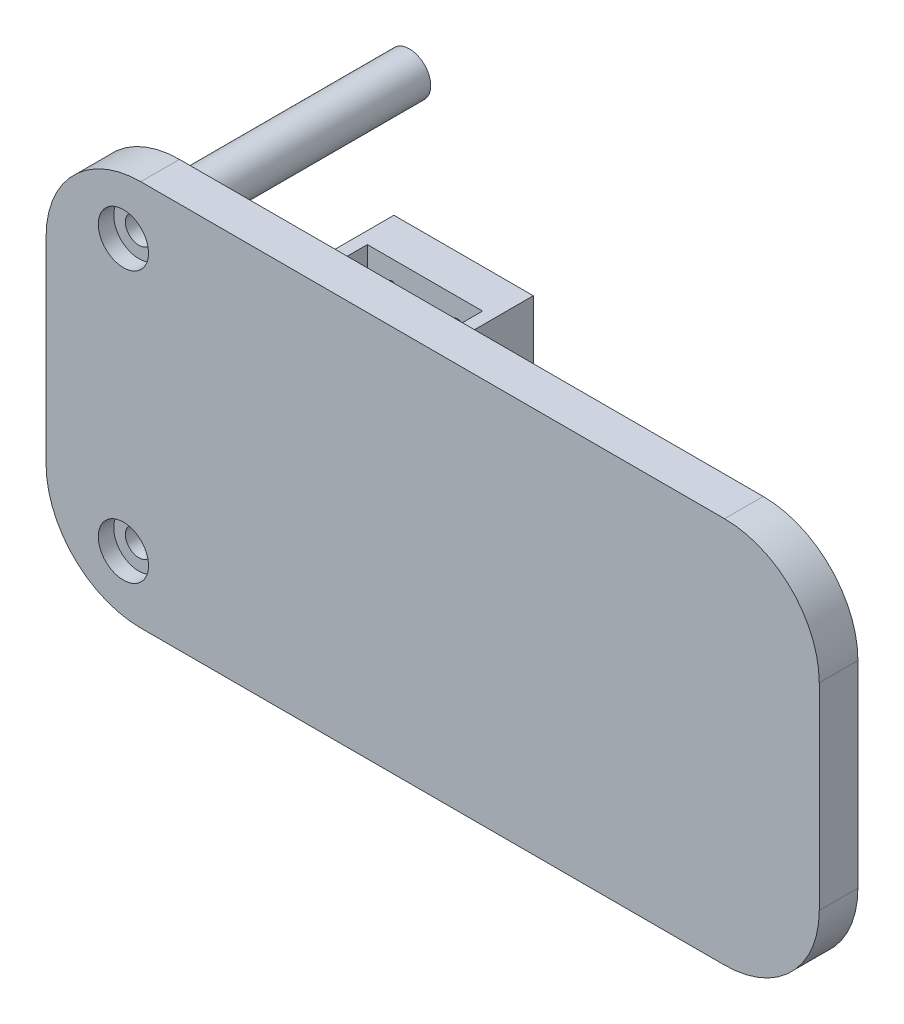
ISO-10303-21;
HEADER;
FILE_DESCRIPTION(('STEP AP214'),'2;1');
FILE_NAME('part.step','',(''),(''),'','','');
FILE_SCHEMA(('AUTOMOTIVE_DESIGN { 1 0 10303 214 1 1 1 1 }'));
ENDSEC;
DATA;
#1=APPLICATION_CONTEXT('core data for automotive mechanical design processes');
#2=APPLICATION_PROTOCOL_DEFINITION('international standard','automotive_design',2000,#1);
#3=PRODUCT_CONTEXT('',#1,'mechanical');
#4=PRODUCT('Part','Part','',(#3));
#5=PRODUCT_RELATED_PRODUCT_CATEGORY('part','',(#4));
#6=PRODUCT_DEFINITION_FORMATION('','',#4);
#7=PRODUCT_DEFINITION_CONTEXT('part definition',#1,'design');
#8=PRODUCT_DEFINITION('design','',#6,#7);
#9=PRODUCT_DEFINITION_SHAPE('','',#8);
#10=(LENGTH_UNIT() NAMED_UNIT(*) SI_UNIT(.MILLI.,.METRE.));
#11=(NAMED_UNIT(*) PLANE_ANGLE_UNIT() SI_UNIT($,.RADIAN.));
#12=(NAMED_UNIT(*) SI_UNIT($,.STERADIAN.) SOLID_ANGLE_UNIT());
#13=UNCERTAINTY_MEASURE_WITH_UNIT(LENGTH_MEASURE(1.E-05),#10,'distance_accuracy_value','');
#14=(GEOMETRIC_REPRESENTATION_CONTEXT(3) GLOBAL_UNCERTAINTY_ASSIGNED_CONTEXT((#13)) GLOBAL_UNIT_ASSIGNED_CONTEXT((#10,
#11,#12)) REPRESENTATION_CONTEXT('',''));
#15=CARTESIAN_POINT('',(0.,0.,0.));
#16=DIRECTION('',(0.,0.,1.));
#17=DIRECTION('',(1.,0.,0.));
#18=AXIS2_PLACEMENT_3D('',#15,#16,#17);
#19=CARTESIAN_POINT('',(0.,0.,0.));
#20=DIRECTION('',(0.,0.,-1.));
#21=DIRECTION('',(-1.,0.,0.));
#22=AXIS2_PLACEMENT_3D('',#19,#20,#21);
#23=PLANE('',#22);
#24=CARTESIAN_POINT('',(-90.,-35.,0.));
#25=DIRECTION('',(0.,0.,-1.));
#26=DIRECTION('',(-1.,0.,0.));
#27=AXIS2_PLACEMENT_3D('',#24,#25,#26);
#28=CIRCLE('',#27,5.5);
#29=CARTESIAN_POINT('',(-95.5,-35.,0.));
#30=VERTEX_POINT('',#29);
#31=EDGE_CURVE('E394',#30,#30,#28,.T.);
#32=ORIENTED_EDGE('',*,*,#31,.F.);
#33=EDGE_LOOP('',(#32));
#34=FACE_BOUND('',#33,.T.);
#35=CARTESIAN_POINT('',(-90.,35.,0.));
#36=DIRECTION('',(0.,0.,-1.));
#37=DIRECTION('',(-1.,0.,0.));
#38=AXIS2_PLACEMENT_3D('',#35,#36,#37);
#39=CIRCLE('',#38,5.5);
#40=CARTESIAN_POINT('',(-95.5,35.,0.));
#41=VERTEX_POINT('',#40);
#42=EDGE_CURVE('E403',#41,#41,#39,.T.);
#43=ORIENTED_EDGE('',*,*,#42,.F.);
#44=EDGE_LOOP('',(#43));
#45=FACE_BOUND('',#44,.T.);
#46=DIRECTION('',(1.,0.,0.));
#47=VECTOR('',#46,1.);
#48=CARTESIAN_POINT('',(-60.0283002547462,35.2184428815414,0.));
#49=LINE('',#48,#47);
#50=CARTESIAN_POINT('',(-60.0283002547462,35.2184428815414,0.));
#51=VERTEX_POINT('',#50);
#52=CARTESIAN_POINT('',(-56.9,35.2184428815414,0.));
#53=VERTEX_POINT('',#52);
#54=EDGE_CURVE('E191',#51,#53,#49,.T.);
#55=ORIENTED_EDGE('',*,*,#54,.F.);
#56=DIRECTION('',(0.,1.,0.));
#57=VECTOR('',#56,1.);
#58=CARTESIAN_POINT('',(-60.0283002547462,-52.7184428815414,0.));
#59=LINE('',#58,#57);
#60=CARTESIAN_POINT('',(-60.0283002547462,-50.,0.));
#61=VERTEX_POINT('',#60);
#62=EDGE_CURVE('E202',#61,#51,#59,.T.);
#63=ORIENTED_EDGE('',*,*,#62,.F.);
#64=DIRECTION('',(1.,0.,0.));
#65=VECTOR('',#64,1.);
#66=CARTESIAN_POINT('',(-90.,-50.,0.));
#67=LINE('',#66,#65);
#68=CARTESIAN_POINT('',(-85.5,-50.,0.));
#69=VERTEX_POINT('',#68);
#70=EDGE_CURVE('E330',#69,#61,#67,.T.);
#71=ORIENTED_EDGE('',*,*,#70,.F.);
#72=CARTESIAN_POINT('',(-85.5,-25.5,0.));
#73=DIRECTION('',(0.,0.,-1.));
#74=DIRECTION('',(-1.,0.,0.));
#75=AXIS2_PLACEMENT_3D('',#72,#73,#74);
#76=CIRCLE('',#75,24.5);
#77=CARTESIAN_POINT('',(-110.,-25.5,0.));
#78=VERTEX_POINT('',#77);
#79=EDGE_CURVE('E354',#69,#78,#76,.T.);
#80=ORIENTED_EDGE('',*,*,#79,.T.);
#81=DIRECTION('',(0.,-1.,0.));
#82=VECTOR('',#81,1.);
#83=CARTESIAN_POINT('',(-110.,-50.,0.));
#84=LINE('',#83,#82);
#85=CARTESIAN_POINT('',(-110.,25.5,0.));
#86=VERTEX_POINT('',#85);
#87=EDGE_CURVE('E345',#86,#78,#84,.T.);
#88=ORIENTED_EDGE('',*,*,#87,.F.);
#89=CARTESIAN_POINT('',(-85.5,25.5,0.));
#90=DIRECTION('',(0.,0.,-1.));
#91=DIRECTION('',(-1.,0.,0.));
#92=AXIS2_PLACEMENT_3D('',#89,#90,#91);
#93=CIRCLE('',#92,24.5);
#94=CARTESIAN_POINT('',(-85.5,50.,0.));
#95=VERTEX_POINT('',#94);
#96=EDGE_CURVE('E357',#86,#95,#93,.T.);
#97=ORIENTED_EDGE('',*,*,#96,.T.);
#98=DIRECTION('',(-1.,0.,0.));
#99=VECTOR('',#98,1.);
#100=CARTESIAN_POINT('',(-90.,50.,0.));
#101=LINE('',#100,#99);
#102=CARTESIAN_POINT('',(65.4999999999999,50.,0.));
#103=VERTEX_POINT('',#102);
#104=EDGE_CURVE('E341',#103,#95,#101,.T.);
#105=ORIENTED_EDGE('',*,*,#104,.F.);
#106=CARTESIAN_POINT('',(65.5,25.5,0.));
#107=DIRECTION('',(0.,0.,-1.));
#108=DIRECTION('',(-1.,0.,0.));
#109=AXIS2_PLACEMENT_3D('',#106,#107,#108);
#110=CIRCLE('',#109,24.5);
#111=CARTESIAN_POINT('',(90.,25.5,0.));
#112=VERTEX_POINT('',#111);
#113=EDGE_CURVE('E355',#103,#112,#110,.T.);
#114=ORIENTED_EDGE('',*,*,#113,.T.);
#115=DIRECTION('',(0.,1.,0.));
#116=VECTOR('',#115,1.);
#117=CARTESIAN_POINT('',(90.,-50.,0.));
#118=LINE('',#117,#116);
#119=CARTESIAN_POINT('',(90.,-25.5,0.));
#120=VERTEX_POINT('',#119);
#121=EDGE_CURVE('E338',#120,#112,#118,.T.);
#122=ORIENTED_EDGE('',*,*,#121,.F.);
#123=CARTESIAN_POINT('',(65.5,-25.5,0.));
#124=DIRECTION('',(0.,0.,-1.));
#125=DIRECTION('',(-1.,0.,0.));
#126=AXIS2_PLACEMENT_3D('',#123,#124,#125);
#127=CIRCLE('',#126,24.5);
#128=CARTESIAN_POINT('',(65.4999999999999,-50.,0.));
#129=VERTEX_POINT('',#128);
#130=EDGE_CURVE('E358',#120,#129,#127,.T.);
#131=ORIENTED_EDGE('',*,*,#130,.T.);
#132=CARTESIAN_POINT('',(-23.9716997452538,-50.,0.));
#133=VERTEX_POINT('',#132);
#134=EDGE_CURVE('E384',#133,#129,#67,.T.);
#135=ORIENTED_EDGE('',*,*,#134,.F.);
#136=DIRECTION('',(0.,-1.,0.));
#137=VECTOR('',#136,1.);
#138=CARTESIAN_POINT('',(-23.9716997452538,-52.7184428815414,0.));
#139=LINE('',#138,#137);
#140=CARTESIAN_POINT('',(-23.9716997452538,35.2184428815414,0.));
#141=VERTEX_POINT('',#140);
#142=EDGE_CURVE('E295',#141,#133,#139,.T.);
#143=ORIENTED_EDGE('',*,*,#142,.F.);
#144=DIRECTION('',(1.,0.,0.));
#145=VECTOR('',#144,1.);
#146=CARTESIAN_POINT('',(-23.9716997452538,35.2184428815414,0.));
#147=LINE('',#146,#145);
#148=CARTESIAN_POINT('',(-27.1,35.2184428815414,0.));
#149=VERTEX_POINT('',#148);
#150=EDGE_CURVE('E291',#149,#141,#147,.T.);
#151=ORIENTED_EDGE('',*,*,#150,.F.);
#152=DIRECTION('',(0.,-1.,0.));
#153=VECTOR('',#152,1.);
#154=CARTESIAN_POINT('',(-27.1,0.,0.));
#155=LINE('',#154,#153);
#156=CARTESIAN_POINT('',(-27.1,-50.,0.));
#157=VERTEX_POINT('',#156);
#158=EDGE_CURVE('E12',#149,#157,#155,.T.);
#159=ORIENTED_EDGE('',*,*,#158,.T.);
#160=CARTESIAN_POINT('',(-56.9,-50.,0.));
#161=VERTEX_POINT('',#160);
#162=EDGE_CURVE('E348',#161,#157,#67,.T.);
#163=ORIENTED_EDGE('',*,*,#162,.F.);
#164=DIRECTION('',(0.,-1.,0.));
#165=VECTOR('',#164,1.);
#166=CARTESIAN_POINT('',(-56.9,-52.7184428815414,0.));
#167=LINE('',#166,#165);
#168=EDGE_CURVE('E50',#53,#161,#167,.T.);
#169=ORIENTED_EDGE('',*,*,#168,.F.);
#170=EDGE_LOOP('',(#55,#63,#71,#80,#88,#97,#105,#114,#122,#131,#135,#143,#151,#159,#163,#169));
#171=FACE_BOUND('',#170,.T.);
#172=ADVANCED_FACE('F35',(#34,#45,#171),#23,.T.);
#173=CARTESIAN_POINT('',(0.,0.,-20.));
#174=DIRECTION('',(0.,0.,1.));
#175=DIRECTION('',(1.,0.,0.));
#176=AXIS2_PLACEMENT_3D('',#173,#174,#175);
#177=PLANE('',#176);
#178=CARTESIAN_POINT('',(-33.5,28.75,-20.));
#179=DIRECTION('',(0.,0.,-1.));
#180=DIRECTION('',(-1.,0.,0.));
#181=AXIS2_PLACEMENT_3D('',#178,#179,#180);
#182=CIRCLE('',#181,1.5);
#183=CARTESIAN_POINT('',(-35.,28.75,-20.));
#184=VERTEX_POINT('',#183);
#185=EDGE_CURVE('E269',#184,#184,#182,.T.);
#186=ORIENTED_EDGE('',*,*,#185,.T.);
#187=EDGE_LOOP('',(#186));
#188=FACE_BOUND('',#187,.T.);
#189=CARTESIAN_POINT('',(-50.5,28.75,-20.));
#190=DIRECTION('',(0.,0.,-1.));
#191=DIRECTION('',(-1.,0.,0.));
#192=AXIS2_PLACEMENT_3D('',#189,#190,#191);
#193=CIRCLE('',#192,1.5);
#194=CARTESIAN_POINT('',(-52.,28.75,-20.));
#195=VERTEX_POINT('',#194);
#196=EDGE_CURVE('E263',#195,#195,#193,.T.);
#197=ORIENTED_EDGE('',*,*,#196,.T.);
#198=EDGE_LOOP('',(#197));
#199=FACE_BOUND('',#198,.T.);
#200=DIRECTION('',(1.,0.,0.));
#201=VECTOR('',#200,1.);
#202=CARTESIAN_POINT('',(-23.9716997452538,35.2184428815414,-20.));
#203=LINE('',#202,#201);
#204=CARTESIAN_POINT('',(-56.9,35.2184428815414,-20.));
#205=VERTEX_POINT('',#204);
#206=CARTESIAN_POINT('',(-27.1,35.2184428815414,-20.));
#207=VERTEX_POINT('',#206);
#208=EDGE_CURVE('E275',#205,#207,#203,.T.);
#209=ORIENTED_EDGE('',*,*,#208,.F.);
#210=DIRECTION('',(0.,1.,0.));
#211=VECTOR('',#210,1.);
#212=CARTESIAN_POINT('',(-56.9,-52.7184428815414,-20.));
#213=LINE('',#212,#211);
#214=CARTESIAN_POINT('',(-56.9,23.75,-20.));
#215=VERTEX_POINT('',#214);
#216=EDGE_CURVE('E222',#215,#205,#213,.T.);
#217=ORIENTED_EDGE('',*,*,#216,.F.);
#218=DIRECTION('',(1.,0.,0.));
#219=VECTOR('',#218,1.);
#220=CARTESIAN_POINT('',(-27.1,23.75,-20.));
#221=LINE('',#220,#219);
#222=CARTESIAN_POINT('',(-27.1,23.75,-20.));
#223=VERTEX_POINT('',#222);
#224=EDGE_CURVE('E226',#215,#223,#221,.T.);
#225=ORIENTED_EDGE('',*,*,#224,.T.);
#226=DIRECTION('',(0.,-1.,0.));
#227=VECTOR('',#226,1.);
#228=CARTESIAN_POINT('',(-27.1,-52.7184428815414,-20.));
#229=LINE('',#228,#227);
#230=EDGE_CURVE('E299',#207,#223,#229,.T.);
#231=ORIENTED_EDGE('',*,*,#230,.F.);
#232=EDGE_LOOP('',(#209,#217,#225,#231));
#233=FACE_BOUND('',#232,.T.);
#234=ADVANCED_FACE('F512',(#188,#199,#233),#177,.T.);
#235=CARTESIAN_POINT('',(-33.5,-46.25,-20.));
#236=DIRECTION('',(0.,0.,-1.));
#237=DIRECTION('',(-1.,0.,0.));
#238=AXIS2_PLACEMENT_3D('',#235,#236,#237);
#239=CIRCLE('',#238,1.5);
#240=CARTESIAN_POINT('',(-35.,-46.25,-20.));
#241=VERTEX_POINT('',#240);
#242=EDGE_CURVE('E251',#241,#241,#239,.T.);
#243=ORIENTED_EDGE('',*,*,#242,.T.);
#244=EDGE_LOOP('',(#243));
#245=FACE_BOUND('',#244,.T.);
#246=CARTESIAN_POINT('',(-50.5,-46.25,-20.));
#247=DIRECTION('',(0.,0.,-1.));
#248=DIRECTION('',(-1.,0.,0.));
#249=AXIS2_PLACEMENT_3D('',#246,#247,#248);
#250=CIRCLE('',#249,1.5);
#251=CARTESIAN_POINT('',(-52.,-46.25,-20.));
#252=VERTEX_POINT('',#251);
#253=EDGE_CURVE('E257',#252,#252,#250,.T.);
#254=ORIENTED_EDGE('',*,*,#253,.T.);
#255=EDGE_LOOP('',(#254));
#256=FACE_BOUND('',#255,.T.);
#257=DIRECTION('',(-1.,0.,0.));
#258=VECTOR('',#257,1.);
#259=CARTESIAN_POINT('',(-27.1,-41.25,-20.));
#260=LINE('',#259,#258);
#261=CARTESIAN_POINT('',(-27.1,-41.25,-20.));
#262=VERTEX_POINT('',#261);
#263=CARTESIAN_POINT('',(-56.9,-41.25,-20.));
#264=VERTEX_POINT('',#263);
#265=EDGE_CURVE('E229',#262,#264,#260,.T.);
#266=ORIENTED_EDGE('',*,*,#265,.T.);
#267=CARTESIAN_POINT('',(-56.9,-52.7184428815414,-20.));
#268=VERTEX_POINT('',#267);
#269=EDGE_CURVE('E58',#268,#264,#213,.T.);
#270=ORIENTED_EDGE('',*,*,#269,.F.);
#271=DIRECTION('',(-1.,0.,0.));
#272=VECTOR('',#271,1.);
#273=CARTESIAN_POINT('',(-23.9716997452538,-52.7184428815414,-20.));
#274=LINE('',#273,#272);
#275=CARTESIAN_POINT('',(-27.1,-52.7184428815414,-20.));
#276=VERTEX_POINT('',#275);
#277=EDGE_CURVE('E198',#276,#268,#274,.T.);
#278=ORIENTED_EDGE('',*,*,#277,.F.);
#279=EDGE_CURVE('E286',#262,#276,#229,.T.);
#280=ORIENTED_EDGE('',*,*,#279,.F.);
#281=EDGE_LOOP('',(#266,#270,#278,#280));
#282=FACE_BOUND('',#281,.T.);
#283=ADVANCED_FACE('F514',(#245,#256,#282),#177,.T.);
#284=CARTESIAN_POINT('',(-90.,35.,-64.));
#285=DIRECTION('',(0.,0.,1.));
#286=DIRECTION('',(1.,0.,0.));
#287=AXIS2_PLACEMENT_3D('',#284,#285,#286);
#288=CYLINDRICAL_SURFACE('',#287,3.50000000000001);
#289=CARTESIAN_POINT('',(-90.,35.,-64.));
#290=DIRECTION('',(0.,0.,-1.));
#291=DIRECTION('',(-1.,0.,0.));
#292=AXIS2_PLACEMENT_3D('',#289,#290,#291);
#293=CIRCLE('',#292,3.50000000000001);
#294=CARTESIAN_POINT('',(-93.5,35.,-64.));
#295=VERTEX_POINT('',#294);
#296=EDGE_CURVE('E393',#295,#295,#293,.T.);
#297=ORIENTED_EDGE('',*,*,#296,.T.);
#298=EDGE_LOOP('',(#297));
#299=FACE_BOUND('',#298,.T.);
#300=CARTESIAN_POINT('',(-90.,35.,6.00000000000001));
#301=DIRECTION('',(0.,0.,1.));
#302=DIRECTION('',(1.,0.,0.));
#303=AXIS2_PLACEMENT_3D('',#300,#301,#302);
#304=CIRCLE('',#303,3.50000000000001);
#305=CARTESIAN_POINT('',(-86.5,35.,6.00000000000001));
#306=VERTEX_POINT('',#305);
#307=EDGE_CURVE('E398',#306,#306,#304,.T.);
#308=ORIENTED_EDGE('',*,*,#307,.T.);
#309=EDGE_LOOP('',(#308));
#310=FACE_BOUND('',#309,.T.);
#311=ADVANCED_FACE('F412',(#299,#310),#288,.F.);
#312=CARTESIAN_POINT('',(-90.,-35.,-64.));
#313=DIRECTION('',(0.,0.,1.));
#314=DIRECTION('',(1.,0.,0.));
#315=AXIS2_PLACEMENT_3D('',#312,#313,#314);
#316=CYLINDRICAL_SURFACE('',#315,3.50000000000001);
#317=CARTESIAN_POINT('',(-90.,-35.,-64.));
#318=DIRECTION('',(0.,0.,-1.));
#319=DIRECTION('',(-1.,0.,0.));
#320=AXIS2_PLACEMENT_3D('',#317,#318,#319);
#321=CIRCLE('',#320,3.50000000000001);
#322=CARTESIAN_POINT('',(-93.5,-35.,-64.));
#323=VERTEX_POINT('',#322);
#324=EDGE_CURVE('E395',#323,#323,#321,.T.);
#325=ORIENTED_EDGE('',*,*,#324,.T.);
#326=EDGE_LOOP('',(#325));
#327=FACE_BOUND('',#326,.T.);
#328=CARTESIAN_POINT('',(-90.,-35.,6.00000000000001));
#329=DIRECTION('',(0.,0.,1.));
#330=DIRECTION('',(1.,0.,0.));
#331=AXIS2_PLACEMENT_3D('',#328,#329,#330);
#332=CIRCLE('',#331,3.50000000000001);
#333=CARTESIAN_POINT('',(-86.5,-35.,6.00000000000001));
#334=VERTEX_POINT('',#333);
#335=EDGE_CURVE('E317',#334,#334,#332,.T.);
#336=ORIENTED_EDGE('',*,*,#335,.T.);
#337=EDGE_LOOP('',(#336));
#338=FACE_BOUND('',#337,.T.);
#339=ADVANCED_FACE('F523',(#327,#338),#316,.F.);
#340=CARTESIAN_POINT('',(90.,-50.,10.));
#341=DIRECTION('',(-1.,0.,0.));
#342=DIRECTION('',(0.,0.,1.));
#343=AXIS2_PLACEMENT_3D('',#340,#341,#342);
#344=PLANE('',#343);
#345=DIRECTION('',(0.,1.,0.));
#346=VECTOR('',#345,1.);
#347=CARTESIAN_POINT('',(90.,-50.,10.));
#348=LINE('',#347,#346);
#349=CARTESIAN_POINT('',(90.,-25.5,10.));
#350=VERTEX_POINT('',#349);
#351=CARTESIAN_POINT('',(90.,25.5,10.));
#352=VERTEX_POINT('',#351);
#353=EDGE_CURVE('E326',#350,#352,#348,.T.);
#354=ORIENTED_EDGE('',*,*,#353,.F.);
#355=DIRECTION('',(0.,0.,-1.));
#356=VECTOR('',#355,1.);
#357=CARTESIAN_POINT('',(90.,-25.5,10.));
#358=LINE('',#357,#356);
#359=EDGE_CURVE('E351',#350,#120,#358,.T.);
#360=ORIENTED_EDGE('',*,*,#359,.T.);
#361=ORIENTED_EDGE('',*,*,#121,.T.);
#362=DIRECTION('',(0.,0.,-1.));
#363=VECTOR('',#362,1.);
#364=CARTESIAN_POINT('',(90.,25.5,10.));
#365=LINE('',#364,#363);
#366=EDGE_CURVE('E337',#112,#352,#365,.F.);
#367=ORIENTED_EDGE('',*,*,#366,.T.);
#368=EDGE_LOOP('',(#354,#360,#361,#367));
#369=FACE_BOUND('',#368,.T.);
#370=ADVANCED_FACE('F447',(#369),#344,.F.);
#371=CARTESIAN_POINT('',(-90.,50.,10.));
#372=DIRECTION('',(0.,-1.,0.));
#373=DIRECTION('',(0.,0.,-1.));
#374=AXIS2_PLACEMENT_3D('',#371,#372,#373);
#375=PLANE('',#374);
#376=ORIENTED_EDGE('',*,*,#104,.T.);
#377=DIRECTION('',(0.,0.,-1.));
#378=VECTOR('',#377,1.);
#379=CARTESIAN_POINT('',(-85.5,50.,10.));
#380=LINE('',#379,#378);
#381=CARTESIAN_POINT('',(-85.5,50.,10.));
#382=VERTEX_POINT('',#381);
#383=EDGE_CURVE('E43',#95,#382,#380,.F.);
#384=ORIENTED_EDGE('',*,*,#383,.T.);
#385=DIRECTION('',(-1.,0.,0.));
#386=VECTOR('',#385,1.);
#387=CARTESIAN_POINT('',(-90.,50.,10.));
#388=LINE('',#387,#386);
#389=CARTESIAN_POINT('',(65.4999999999999,50.,10.));
#390=VERTEX_POINT('',#389);
#391=EDGE_CURVE('E329',#390,#382,#388,.T.);
#392=ORIENTED_EDGE('',*,*,#391,.F.);
#393=DIRECTION('',(0.,0.,-1.));
#394=VECTOR('',#393,1.);
#395=CARTESIAN_POINT('',(65.5,50.,10.));
#396=LINE('',#395,#394);
#397=EDGE_CURVE('E371',#390,#103,#396,.T.);
#398=ORIENTED_EDGE('',*,*,#397,.T.);
#399=EDGE_LOOP('',(#376,#384,#392,#398));
#400=FACE_BOUND('',#399,.T.);
#401=ADVANCED_FACE('F457',(#400),#375,.F.);
#402=CARTESIAN_POINT('',(-110.,-50.,10.));
#403=DIRECTION('',(1.,0.,0.));
#404=DIRECTION('',(0.,0.,-1.));
#405=AXIS2_PLACEMENT_3D('',#402,#403,#404);
#406=PLANE('',#405);
#407=DIRECTION('',(0.,-1.,0.));
#408=VECTOR('',#407,1.);
#409=CARTESIAN_POINT('',(-110.,-50.,10.));
#410=LINE('',#409,#408);
#411=CARTESIAN_POINT('',(-110.,25.5,10.));
#412=VERTEX_POINT('',#411);
#413=CARTESIAN_POINT('',(-110.,-25.5,10.));
#414=VERTEX_POINT('',#413);
#415=EDGE_CURVE('E333',#412,#414,#410,.T.);
#416=ORIENTED_EDGE('',*,*,#415,.F.);
#417=DIRECTION('',(0.,0.,-1.));
#418=VECTOR('',#417,1.);
#419=CARTESIAN_POINT('',(-110.,25.5,10.));
#420=LINE('',#419,#418);
#421=EDGE_CURVE('E374',#412,#86,#420,.T.);
#422=ORIENTED_EDGE('',*,*,#421,.T.);
#423=ORIENTED_EDGE('',*,*,#87,.T.);
#424=DIRECTION('',(0.,0.,-1.));
#425=VECTOR('',#424,1.);
#426=CARTESIAN_POINT('',(-110.,-25.5,10.));
#427=LINE('',#426,#425);
#428=EDGE_CURVE('E370',#78,#414,#427,.F.);
#429=ORIENTED_EDGE('',*,*,#428,.T.);
#430=EDGE_LOOP('',(#416,#422,#423,#429));
#431=FACE_BOUND('',#430,.T.);
#432=ADVANCED_FACE('F466',(#431),#406,.F.);
#433=CARTESIAN_POINT('',(-90.,-50.,10.));
#434=DIRECTION('',(0.,1.,0.));
#435=DIRECTION('',(0.,0.,1.));
#436=AXIS2_PLACEMENT_3D('',#433,#434,#435);
#437=PLANE('',#436);
#438=ORIENTED_EDGE('',*,*,#70,.T.);
#439=EDGE_CURVE('E347',#61,#161,#67,.T.);
#440=ORIENTED_EDGE('',*,*,#439,.T.);
#441=ORIENTED_EDGE('',*,*,#162,.T.);
#442=EDGE_CURVE('E349',#157,#133,#67,.T.);
#443=ORIENTED_EDGE('',*,*,#442,.T.);
#444=ORIENTED_EDGE('',*,*,#134,.T.);
#445=DIRECTION('',(0.,0.,-1.));
#446=VECTOR('',#445,1.);
#447=CARTESIAN_POINT('',(65.5,-50.,10.));
#448=LINE('',#447,#446);
#449=CARTESIAN_POINT('',(65.4999999999999,-50.,10.));
#450=VERTEX_POINT('',#449);
#451=EDGE_CURVE('E362',#129,#450,#448,.F.);
#452=ORIENTED_EDGE('',*,*,#451,.T.);
#453=DIRECTION('',(1.,0.,0.));
#454=VECTOR('',#453,1.);
#455=CARTESIAN_POINT('',(-90.,-50.,10.));
#456=LINE('',#455,#454);
#457=CARTESIAN_POINT('',(-85.5,-50.,10.));
#458=VERTEX_POINT('',#457);
#459=EDGE_CURVE('E334',#458,#450,#456,.T.);
#460=ORIENTED_EDGE('',*,*,#459,.F.);
#461=DIRECTION('',(0.,0.,-1.));
#462=VECTOR('',#461,1.);
#463=CARTESIAN_POINT('',(-85.5,-50.,10.));
#464=LINE('',#463,#462);
#465=EDGE_CURVE('E361',#458,#69,#464,.T.);
#466=ORIENTED_EDGE('',*,*,#465,.T.);
#467=EDGE_LOOP('',(#438,#440,#441,#443,#444,#452,#460,#466));
#468=FACE_BOUND('',#467,.T.);
#469=ADVANCED_FACE('F432',(#468),#437,.F.);
#470=CARTESIAN_POINT('',(0.,0.,10.));
#471=DIRECTION('',(0.,0.,-1.));
#472=DIRECTION('',(-1.,0.,0.));
#473=AXIS2_PLACEMENT_3D('',#470,#471,#472);
#474=PLANE('',#473);
#475=CARTESIAN_POINT('',(-90.,35.,10.));
#476=DIRECTION('',(0.,0.,1.));
#477=DIRECTION('',(1.,0.,0.));
#478=AXIS2_PLACEMENT_3D('',#475,#476,#477);
#479=CIRCLE('',#478,6.5);
#480=CARTESIAN_POINT('',(-83.5,35.,10.));
#481=VERTEX_POINT('',#480);
#482=EDGE_CURVE('E318',#481,#481,#479,.T.);
#483=ORIENTED_EDGE('',*,*,#482,.F.);
#484=EDGE_LOOP('',(#483));
#485=FACE_BOUND('',#484,.T.);
#486=CARTESIAN_POINT('',(-90.,-35.,10.));
#487=DIRECTION('',(0.,0.,1.));
#488=DIRECTION('',(1.,0.,0.));
#489=AXIS2_PLACEMENT_3D('',#486,#487,#488);
#490=CIRCLE('',#489,6.49999999999999);
#491=CARTESIAN_POINT('',(-83.5,-35.,10.));
#492=VERTEX_POINT('',#491);
#493=EDGE_CURVE('E298',#492,#492,#490,.T.);
#494=ORIENTED_EDGE('',*,*,#493,.F.);
#495=EDGE_LOOP('',(#494));
#496=FACE_BOUND('',#495,.T.);
#497=ORIENTED_EDGE('',*,*,#459,.T.);
#498=CARTESIAN_POINT('',(65.5,-25.5,10.));
#499=DIRECTION('',(0.,0.,-1.));
#500=DIRECTION('',(-1.,0.,0.));
#501=AXIS2_PLACEMENT_3D('',#498,#499,#500);
#502=CIRCLE('',#501,24.5);
#503=EDGE_CURVE('E368',#450,#350,#502,.F.);
#504=ORIENTED_EDGE('',*,*,#503,.T.);
#505=ORIENTED_EDGE('',*,*,#353,.T.);
#506=CARTESIAN_POINT('',(65.5,25.5,10.));
#507=DIRECTION('',(0.,0.,-1.));
#508=DIRECTION('',(-1.,0.,0.));
#509=AXIS2_PLACEMENT_3D('',#506,#507,#508);
#510=CIRCLE('',#509,24.5);
#511=EDGE_CURVE('E365',#352,#390,#510,.F.);
#512=ORIENTED_EDGE('',*,*,#511,.T.);
#513=ORIENTED_EDGE('',*,*,#391,.T.);
#514=CARTESIAN_POINT('',(-85.5,25.5,10.));
#515=DIRECTION('',(0.,0.,-1.));
#516=DIRECTION('',(-1.,0.,0.));
#517=AXIS2_PLACEMENT_3D('',#514,#515,#516);
#518=CIRCLE('',#517,24.5);
#519=EDGE_CURVE('E367',#382,#412,#518,.F.);
#520=ORIENTED_EDGE('',*,*,#519,.T.);
#521=ORIENTED_EDGE('',*,*,#415,.T.);
#522=CARTESIAN_POINT('',(-85.5,-25.5,10.));
#523=DIRECTION('',(0.,0.,-1.));
#524=DIRECTION('',(-1.,0.,0.));
#525=AXIS2_PLACEMENT_3D('',#522,#523,#524);
#526=CIRCLE('',#525,24.5);
#527=EDGE_CURVE('E364',#414,#458,#526,.F.);
#528=ORIENTED_EDGE('',*,*,#527,.T.);
#529=EDGE_LOOP('',(#497,#504,#505,#512,#513,#520,#521,#528));
#530=FACE_BOUND('',#529,.T.);
#531=ADVANCED_FACE('F428',(#485,#496,#530),#474,.F.);
#532=CARTESIAN_POINT('',(65.5,-25.5,10.));
#533=DIRECTION('',(0.,0.,-1.));
#534=DIRECTION('',(-1.,0.,0.));
#535=AXIS2_PLACEMENT_3D('',#532,#533,#534);
#536=CYLINDRICAL_SURFACE('',#535,24.5);
#537=ORIENTED_EDGE('',*,*,#503,.F.);
#538=ORIENTED_EDGE('',*,*,#451,.F.);
#539=ORIENTED_EDGE('',*,*,#130,.F.);
#540=ORIENTED_EDGE('',*,*,#359,.F.);
#541=EDGE_LOOP('',(#537,#538,#539,#540));
#542=FACE_BOUND('',#541,.T.);
#543=ADVANCED_FACE('F431',(#542),#536,.T.);
#544=CARTESIAN_POINT('',(-85.5,25.5,10.));
#545=DIRECTION('',(0.,0.,-1.));
#546=DIRECTION('',(-1.,0.,0.));
#547=AXIS2_PLACEMENT_3D('',#544,#545,#546);
#548=CYLINDRICAL_SURFACE('',#547,24.5);
#549=ORIENTED_EDGE('',*,*,#519,.F.);
#550=ORIENTED_EDGE('',*,*,#383,.F.);
#551=ORIENTED_EDGE('',*,*,#96,.F.);
#552=ORIENTED_EDGE('',*,*,#421,.F.);
#553=EDGE_LOOP('',(#549,#550,#551,#552));
#554=FACE_BOUND('',#553,.T.);
#555=ADVANCED_FACE('F463',(#554),#548,.T.);
#556=CARTESIAN_POINT('',(65.5,25.5,10.));
#557=DIRECTION('',(0.,0.,-1.));
#558=DIRECTION('',(-1.,0.,0.));
#559=AXIS2_PLACEMENT_3D('',#556,#557,#558);
#560=CYLINDRICAL_SURFACE('',#559,24.5);
#561=ORIENTED_EDGE('',*,*,#511,.F.);
#562=ORIENTED_EDGE('',*,*,#366,.F.);
#563=ORIENTED_EDGE('',*,*,#113,.F.);
#564=ORIENTED_EDGE('',*,*,#397,.F.);
#565=EDGE_LOOP('',(#561,#562,#563,#564));
#566=FACE_BOUND('',#565,.T.);
#567=ADVANCED_FACE('F454',(#566),#560,.T.);
#568=CARTESIAN_POINT('',(-85.5,-25.5,10.));
#569=DIRECTION('',(0.,0.,-1.));
#570=DIRECTION('',(-1.,0.,0.));
#571=AXIS2_PLACEMENT_3D('',#568,#569,#570);
#572=CYLINDRICAL_SURFACE('',#571,24.5);
#573=ORIENTED_EDGE('',*,*,#527,.F.);
#574=ORIENTED_EDGE('',*,*,#428,.F.);
#575=ORIENTED_EDGE('',*,*,#79,.F.);
#576=ORIENTED_EDGE('',*,*,#465,.F.);
#577=EDGE_LOOP('',(#573,#574,#575,#576));
#578=FACE_BOUND('',#577,.T.);
#579=ADVANCED_FACE('F469',(#578),#572,.T.);
#580=CARTESIAN_POINT('',(-90.,35.,-64.));
#581=DIRECTION('',(0.,0.,-1.));
#582=DIRECTION('',(-1.,0.,0.));
#583=AXIS2_PLACEMENT_3D('',#580,#581,#582);
#584=PLANE('',#583);
#585=CARTESIAN_POINT('',(-90.,35.,-64.));
#586=DIRECTION('',(0.,0.,-1.));
#587=DIRECTION('',(-1.,0.,0.));
#588=AXIS2_PLACEMENT_3D('',#585,#586,#587);
#589=CIRCLE('',#588,5.5);
#590=CARTESIAN_POINT('',(-95.5,35.,-64.));
#591=VERTEX_POINT('',#590);
#592=EDGE_CURVE('E342',#591,#591,#589,.T.);
#593=ORIENTED_EDGE('',*,*,#592,.T.);
#594=EDGE_LOOP('',(#593));
#595=FACE_BOUND('',#594,.T.);
#596=ORIENTED_EDGE('',*,*,#296,.F.);
#597=EDGE_LOOP('',(#596));
#598=FACE_BOUND('',#597,.T.);
#599=ADVANCED_FACE('F553',(#595,#598),#584,.T.);
#600=CARTESIAN_POINT('',(-90.,35.,-64.));
#601=DIRECTION('',(0.,0.,1.));
#602=DIRECTION('',(1.,0.,0.));
#603=AXIS2_PLACEMENT_3D('',#600,#601,#602);
#604=CYLINDRICAL_SURFACE('',#603,5.5);
#605=ORIENTED_EDGE('',*,*,#592,.F.);
#606=EDGE_LOOP('',(#605));
#607=FACE_BOUND('',#606,.T.);
#608=ORIENTED_EDGE('',*,*,#42,.T.);
#609=EDGE_LOOP('',(#608));
#610=FACE_BOUND('',#609,.T.);
#611=ADVANCED_FACE('F37',(#607,#610),#604,.T.);
#612=CARTESIAN_POINT('',(-90.,-35.,-64.));
#613=DIRECTION('',(0.,0.,-1.));
#614=DIRECTION('',(-1.,0.,0.));
#615=AXIS2_PLACEMENT_3D('',#612,#613,#614);
#616=PLANE('',#615);
#617=CARTESIAN_POINT('',(-90.,-35.,-64.));
#618=DIRECTION('',(0.,0.,-1.));
#619=DIRECTION('',(-1.,0.,0.));
#620=AXIS2_PLACEMENT_3D('',#617,#618,#619);
#621=CIRCLE('',#620,5.5);
#622=CARTESIAN_POINT('',(-95.5,-35.,-64.));
#623=VERTEX_POINT('',#622);
#624=EDGE_CURVE('E390',#623,#623,#621,.T.);
#625=ORIENTED_EDGE('',*,*,#624,.T.);
#626=EDGE_LOOP('',(#625));
#627=FACE_BOUND('',#626,.T.);
#628=ORIENTED_EDGE('',*,*,#324,.F.);
#629=EDGE_LOOP('',(#628));
#630=FACE_BOUND('',#629,.T.);
#631=ADVANCED_FACE('F561',(#627,#630),#616,.T.);
#632=CARTESIAN_POINT('',(-90.,-35.,-64.));
#633=DIRECTION('',(0.,0.,1.));
#634=DIRECTION('',(1.,0.,0.));
#635=AXIS2_PLACEMENT_3D('',#632,#633,#634);
#636=CYLINDRICAL_SURFACE('',#635,5.5);
#637=ORIENTED_EDGE('',*,*,#624,.F.);
#638=EDGE_LOOP('',(#637));
#639=FACE_BOUND('',#638,.T.);
#640=ORIENTED_EDGE('',*,*,#31,.T.);
#641=EDGE_LOOP('',(#640));
#642=FACE_BOUND('',#641,.T.);
#643=ADVANCED_FACE('F564',(#639,#642),#636,.T.);
#644=CARTESIAN_POINT('',(-90.,-35.,6.));
#645=DIRECTION('',(0.,0.,1.));
#646=DIRECTION('',(1.,0.,0.));
#647=AXIS2_PLACEMENT_3D('',#644,#645,#646);
#648=CYLINDRICAL_SURFACE('',#647,6.49999999999999);
#649=CARTESIAN_POINT('',(-90.,-35.,6.));
#650=DIRECTION('',(0.,0.,1.));
#651=DIRECTION('',(1.,0.,0.));
#652=AXIS2_PLACEMENT_3D('',#649,#650,#651);
#653=CIRCLE('',#652,6.49999999999999);
#654=CARTESIAN_POINT('',(-83.5,-35.,6.));
#655=VERTEX_POINT('',#654);
#656=EDGE_CURVE('E321',#655,#655,#653,.T.);
#657=ORIENTED_EDGE('',*,*,#656,.F.);
#658=EDGE_LOOP('',(#657));
#659=FACE_BOUND('',#658,.T.);
#660=ORIENTED_EDGE('',*,*,#493,.T.);
#661=EDGE_LOOP('',(#660));
#662=FACE_BOUND('',#661,.T.);
#663=ADVANCED_FACE('F569',(#659,#662),#648,.F.);
#664=CARTESIAN_POINT('',(-90.,-35.,6.));
#665=DIRECTION('',(0.,0.,1.));
#666=DIRECTION('',(1.,0.,0.));
#667=AXIS2_PLACEMENT_3D('',#664,#665,#666);
#668=PLANE('',#667);
#669=ORIENTED_EDGE('',*,*,#335,.F.);
#670=EDGE_LOOP('',(#669));
#671=FACE_BOUND('',#670,.T.);
#672=ORIENTED_EDGE('',*,*,#656,.T.);
#673=EDGE_LOOP('',(#672));
#674=FACE_BOUND('',#673,.T.);
#675=ADVANCED_FACE('F424',(#671,#674),#668,.T.);
#676=CARTESIAN_POINT('',(-90.,35.,6.));
#677=DIRECTION('',(0.,0.,1.));
#678=DIRECTION('',(1.,0.,0.));
#679=AXIS2_PLACEMENT_3D('',#676,#677,#678);
#680=CYLINDRICAL_SURFACE('',#679,6.5);
#681=CARTESIAN_POINT('',(-90.,35.,6.));
#682=DIRECTION('',(0.,0.,1.));
#683=DIRECTION('',(1.,0.,0.));
#684=AXIS2_PLACEMENT_3D('',#681,#682,#683);
#685=CIRCLE('',#684,6.5);
#686=CARTESIAN_POINT('',(-83.5,35.,6.));
#687=VERTEX_POINT('',#686);
#688=EDGE_CURVE('E314',#687,#687,#685,.T.);
#689=ORIENTED_EDGE('',*,*,#688,.F.);
#690=EDGE_LOOP('',(#689));
#691=FACE_BOUND('',#690,.T.);
#692=ORIENTED_EDGE('',*,*,#482,.T.);
#693=EDGE_LOOP('',(#692));
#694=FACE_BOUND('',#693,.T.);
#695=ADVANCED_FACE('F418',(#691,#694),#680,.F.);
#696=CARTESIAN_POINT('',(-90.,35.,6.));
#697=DIRECTION('',(0.,0.,1.));
#698=DIRECTION('',(1.,0.,0.));
#699=AXIS2_PLACEMENT_3D('',#696,#697,#698);
#700=PLANE('',#699);
#701=ORIENTED_EDGE('',*,*,#307,.F.);
#702=EDGE_LOOP('',(#701));
#703=FACE_BOUND('',#702,.T.);
#704=ORIENTED_EDGE('',*,*,#688,.T.);
#705=EDGE_LOOP('',(#704));
#706=FACE_BOUND('',#705,.T.);
#707=ADVANCED_FACE('F414',(#703,#706),#700,.T.);
#708=CARTESIAN_POINT('',(0.,0.,0.));
#709=DIRECTION('',(0.,0.,-1.));
#710=DIRECTION('',(-1.,0.,0.));
#711=AXIS2_PLACEMENT_3D('',#708,#709,#710);
#712=PLANE('',#711);
#713=CARTESIAN_POINT('',(-23.9716997452538,-52.7184428815414,0.));
#714=VERTEX_POINT('',#713);
#715=EDGE_CURVE('E294',#133,#714,#139,.T.);
#716=ORIENTED_EDGE('',*,*,#715,.F.);
#717=ORIENTED_EDGE('',*,*,#442,.F.);
#718=DIRECTION('',(0.,1.,0.));
#719=VECTOR('',#718,1.);
#720=CARTESIAN_POINT('',(-27.1,-52.7184428815414,0.));
#721=LINE('',#720,#719);
#722=CARTESIAN_POINT('',(-27.1,-52.7184428815414,0.));
#723=VERTEX_POINT('',#722);
#724=EDGE_CURVE('E288',#723,#157,#721,.T.);
#725=ORIENTED_EDGE('',*,*,#724,.F.);
#726=DIRECTION('',(-1.,0.,0.));
#727=VECTOR('',#726,1.);
#728=CARTESIAN_POINT('',(-23.9716997452538,-52.7184428815414,0.));
#729=LINE('',#728,#727);
#730=EDGE_CURVE('E292',#714,#723,#729,.T.);
#731=ORIENTED_EDGE('',*,*,#730,.F.);
#732=EDGE_LOOP('',(#716,#717,#725,#731));
#733=FACE_BOUND('',#732,.T.);
#734=ADVANCED_FACE('F417',(#733),#712,.F.);
#735=CARTESIAN_POINT('',(-23.9716997452538,-52.7184428815414,87.9925118415955));
#736=DIRECTION('',(0.,1.,0.));
#737=DIRECTION('',(0.,0.,1.));
#738=AXIS2_PLACEMENT_3D('',#735,#736,#737);
#739=PLANE('',#738);
#740=DIRECTION('',(0.,0.,-1.));
#741=VECTOR('',#740,1.);
#742=CARTESIAN_POINT('',(-23.9716997452538,-52.7184428815414,87.9925118415955));
#743=LINE('',#742,#741);
#744=CARTESIAN_POINT('',(-23.9716997452538,-52.7184428815414,-30.));
#745=VERTEX_POINT('',#744);
#746=EDGE_CURVE('E302',#714,#745,#743,.T.);
#747=ORIENTED_EDGE('',*,*,#746,.F.);
#748=ORIENTED_EDGE('',*,*,#730,.T.);
#749=DIRECTION('',(0.,0.,-1.));
#750=VECTOR('',#749,1.);
#751=CARTESIAN_POINT('',(-27.1,-52.7184428815414,87.9925118415955));
#752=LINE('',#751,#750);
#753=EDGE_CURVE('E304',#723,#276,#752,.T.);
#754=ORIENTED_EDGE('',*,*,#753,.T.);
#755=ORIENTED_EDGE('',*,*,#277,.T.);
#756=DIRECTION('',(0.,0.,-1.));
#757=VECTOR('',#756,1.);
#758=CARTESIAN_POINT('',(-56.9,-52.7184428815414,87.9925118415955));
#759=LINE('',#758,#757);
#760=CARTESIAN_POINT('',(-56.9,-52.7184428815414,0.));
#761=VERTEX_POINT('',#760);
#762=EDGE_CURVE('E209',#761,#268,#759,.T.);
#763=ORIENTED_EDGE('',*,*,#762,.F.);
#764=DIRECTION('',(-1.,0.,0.));
#765=VECTOR('',#764,1.);
#766=CARTESIAN_POINT('',(-60.0283002547462,-52.7184428815414,0.));
#767=LINE('',#766,#765);
#768=CARTESIAN_POINT('',(-60.0283002547462,-52.7184428815414,0.));
#769=VERTEX_POINT('',#768);
#770=EDGE_CURVE('E216',#761,#769,#767,.T.);
#771=ORIENTED_EDGE('',*,*,#770,.T.);
#772=DIRECTION('',(0.,0.,-1.));
#773=VECTOR('',#772,1.);
#774=CARTESIAN_POINT('',(-60.0283002547462,-52.7184428815414,-20.));
#775=LINE('',#774,#773);
#776=CARTESIAN_POINT('',(-60.0283002547462,-52.7184428815414,-30.));
#777=VERTEX_POINT('',#776);
#778=EDGE_CURVE('E197',#769,#777,#775,.T.);
#779=ORIENTED_EDGE('',*,*,#778,.T.);
#780=DIRECTION('',(-1.,0.,0.));
#781=VECTOR('',#780,1.);
#782=CARTESIAN_POINT('',(-23.9716997452538,-52.7184428815414,-30.));
#783=LINE('',#782,#781);
#784=EDGE_CURVE('E277',#745,#777,#783,.T.);
#785=ORIENTED_EDGE('',*,*,#784,.F.);
#786=EDGE_LOOP('',(#747,#748,#754,#755,#763,#771,#779,#785));
#787=FACE_BOUND('',#786,.T.);
#788=ADVANCED_FACE('F494',(#787),#739,.F.);
#789=CARTESIAN_POINT('',(-27.1,-52.7184428815414,87.9925118415955));
#790=DIRECTION('',(1.,0.,0.));
#791=DIRECTION('',(0.,0.,-1.));
#792=AXIS2_PLACEMENT_3D('',#789,#790,#791);
#793=PLANE('',#792);
#794=ORIENTED_EDGE('',*,*,#753,.F.);
#795=ORIENTED_EDGE('',*,*,#724,.T.);
#796=ORIENTED_EDGE('',*,*,#158,.F.);
#797=DIRECTION('',(0.,0.,-1.));
#798=VECTOR('',#797,1.);
#799=CARTESIAN_POINT('',(-27.1,35.2184428815414,87.9925118415955));
#800=LINE('',#799,#798);
#801=EDGE_CURVE('E307',#149,#207,#800,.T.);
#802=ORIENTED_EDGE('',*,*,#801,.T.);
#803=ORIENTED_EDGE('',*,*,#230,.T.);
#804=DIRECTION('',(0.,0.,-1.));
#805=VECTOR('',#804,1.);
#806=CARTESIAN_POINT('',(-27.1,23.75,-20.));
#807=LINE('',#806,#805);
#808=CARTESIAN_POINT('',(-27.1,23.75,-30.));
#809=VERTEX_POINT('',#808);
#810=EDGE_CURVE('E247',#223,#809,#807,.T.);
#811=ORIENTED_EDGE('',*,*,#810,.T.);
#812=DIRECTION('',(0.,-1.,0.));
#813=VECTOR('',#812,1.);
#814=CARTESIAN_POINT('',(-27.1,-41.25,-30.));
#815=LINE('',#814,#813);
#816=CARTESIAN_POINT('',(-27.1,-41.25,-30.));
#817=VERTEX_POINT('',#816);
#818=EDGE_CURVE('E237',#809,#817,#815,.T.);
#819=ORIENTED_EDGE('',*,*,#818,.T.);
#820=DIRECTION('',(0.,0.,-1.));
#821=VECTOR('',#820,1.);
#822=CARTESIAN_POINT('',(-27.1,-41.25,-20.));
#823=LINE('',#822,#821);
#824=EDGE_CURVE('E245',#262,#817,#823,.T.);
#825=ORIENTED_EDGE('',*,*,#824,.F.);
#826=ORIENTED_EDGE('',*,*,#279,.T.);
#827=EDGE_LOOP('',(#794,#795,#796,#802,#803,#811,#819,#825,#826));
#828=FACE_BOUND('',#827,.T.);
#829=ADVANCED_FACE('F478',(#828),#793,.F.);
#830=CARTESIAN_POINT('',(-23.9716997452538,35.2184428815414,87.9925118415955));
#831=DIRECTION('',(0.,-1.,0.));
#832=DIRECTION('',(0.,0.,-1.));
#833=AXIS2_PLACEMENT_3D('',#830,#831,#832);
#834=PLANE('',#833);
#835=ORIENTED_EDGE('',*,*,#801,.F.);
#836=ORIENTED_EDGE('',*,*,#150,.T.);
#837=DIRECTION('',(0.,0.,-1.));
#838=VECTOR('',#837,1.);
#839=CARTESIAN_POINT('',(-23.9716997452538,35.2184428815414,87.9925118415955));
#840=LINE('',#839,#838);
#841=CARTESIAN_POINT('',(-23.9716997452538,35.2184428815414,-30.));
#842=VERTEX_POINT('',#841);
#843=EDGE_CURVE('E310',#141,#842,#840,.T.);
#844=ORIENTED_EDGE('',*,*,#843,.T.);
#845=DIRECTION('',(1.,0.,0.));
#846=VECTOR('',#845,1.);
#847=CARTESIAN_POINT('',(-23.9716997452538,35.2184428815414,-30.));
#848=LINE('',#847,#846);
#849=CARTESIAN_POINT('',(-60.0283002547462,35.2184428815414,-30.));
#850=VERTEX_POINT('',#849);
#851=EDGE_CURVE('E193',#850,#842,#848,.T.);
#852=ORIENTED_EDGE('',*,*,#851,.F.);
#853=DIRECTION('',(0.,0.,-1.));
#854=VECTOR('',#853,1.);
#855=CARTESIAN_POINT('',(-60.0283002547462,35.2184428815414,-20.));
#856=LINE('',#855,#854);
#857=EDGE_CURVE('E185',#51,#850,#856,.T.);
#858=ORIENTED_EDGE('',*,*,#857,.F.);
#859=ORIENTED_EDGE('',*,*,#54,.T.);
#860=DIRECTION('',(0.,0.,-1.));
#861=VECTOR('',#860,1.);
#862=CARTESIAN_POINT('',(-56.9,35.2184428815414,87.9925118415955));
#863=LINE('',#862,#861);
#864=EDGE_CURVE('E221',#53,#205,#863,.T.);
#865=ORIENTED_EDGE('',*,*,#864,.T.);
#866=ORIENTED_EDGE('',*,*,#208,.T.);
#867=EDGE_LOOP('',(#835,#836,#844,#852,#858,#859,#865,#866));
#868=FACE_BOUND('',#867,.T.);
#869=ADVANCED_FACE('F188',(#868),#834,.F.);
#870=CARTESIAN_POINT('',(-23.9716997452538,-52.7184428815414,87.9925118415955));
#871=DIRECTION('',(-1.,0.,0.));
#872=DIRECTION('',(0.,0.,1.));
#873=AXIS2_PLACEMENT_3D('',#870,#871,#872);
#874=PLANE('',#873);
#875=ORIENTED_EDGE('',*,*,#843,.F.);
#876=ORIENTED_EDGE('',*,*,#142,.T.);
#877=ORIENTED_EDGE('',*,*,#715,.T.);
#878=ORIENTED_EDGE('',*,*,#746,.T.);
#879=DIRECTION('',(0.,-1.,0.));
#880=VECTOR('',#879,1.);
#881=CARTESIAN_POINT('',(-23.9716997452538,-52.7184428815414,-30.));
#882=LINE('',#881,#880);
#883=EDGE_CURVE('E281',#842,#745,#882,.T.);
#884=ORIENTED_EDGE('',*,*,#883,.F.);
#885=EDGE_LOOP('',(#875,#876,#877,#878,#884));
#886=FACE_BOUND('',#885,.T.);
#887=ADVANCED_FACE('F485',(#886),#874,.F.);
#888=CARTESIAN_POINT('',(-60.0283002547462,-52.7184428815414,-20.));
#889=DIRECTION('',(-1.,0.,0.));
#890=DIRECTION('',(0.,0.,1.));
#891=AXIS2_PLACEMENT_3D('',#888,#889,#890);
#892=PLANE('',#891);
#893=DIRECTION('',(0.,1.,0.));
#894=VECTOR('',#893,1.);
#895=CARTESIAN_POINT('',(-60.0283002547462,-52.7184428815414,-30.));
#896=LINE('',#895,#894);
#897=EDGE_CURVE('E272',#777,#850,#896,.T.);
#898=ORIENTED_EDGE('',*,*,#897,.F.);
#899=ORIENTED_EDGE('',*,*,#778,.F.);
#900=EDGE_CURVE('E205',#769,#61,#59,.T.);
#901=ORIENTED_EDGE('',*,*,#900,.T.);
#902=ORIENTED_EDGE('',*,*,#62,.T.);
#903=ORIENTED_EDGE('',*,*,#857,.T.);
#904=EDGE_LOOP('',(#898,#899,#901,#902,#903));
#905=FACE_BOUND('',#904,.T.);
#906=ADVANCED_FACE('F203',(#905),#892,.T.);
#907=CARTESIAN_POINT('',(0.,0.,-30.));
#908=DIRECTION('',(0.,0.,1.));
#909=DIRECTION('',(1.,0.,0.));
#910=AXIS2_PLACEMENT_3D('',#907,#908,#909);
#911=PLANE('',#910);
#912=DIRECTION('',(1.,0.,0.));
#913=VECTOR('',#912,1.);
#914=CARTESIAN_POINT('',(-27.1,23.75,-30.));
#915=LINE('',#914,#913);
#916=CARTESIAN_POINT('',(-56.9,23.75,-30.));
#917=VERTEX_POINT('',#916);
#918=EDGE_CURVE('E234',#917,#809,#915,.T.);
#919=ORIENTED_EDGE('',*,*,#918,.F.);
#920=DIRECTION('',(0.,1.,0.));
#921=VECTOR('',#920,1.);
#922=CARTESIAN_POINT('',(-56.9,-41.25,-30.));
#923=LINE('',#922,#921);
#924=CARTESIAN_POINT('',(-56.9,-41.25,-30.));
#925=VERTEX_POINT('',#924);
#926=EDGE_CURVE('E219',#925,#917,#923,.T.);
#927=ORIENTED_EDGE('',*,*,#926,.F.);
#928=DIRECTION('',(-1.,0.,0.));
#929=VECTOR('',#928,1.);
#930=CARTESIAN_POINT('',(-27.1,-41.25,-30.));
#931=LINE('',#930,#929);
#932=EDGE_CURVE('E230',#817,#925,#931,.T.);
#933=ORIENTED_EDGE('',*,*,#932,.F.);
#934=ORIENTED_EDGE('',*,*,#818,.F.);
#935=EDGE_LOOP('',(#919,#927,#933,#934));
#936=FACE_BOUND('',#935,.T.);
#937=CARTESIAN_POINT('',(-33.5,-46.25,-30.));
#938=DIRECTION('',(0.,0.,-1.));
#939=DIRECTION('',(-1.,0.,0.));
#940=AXIS2_PLACEMENT_3D('',#937,#938,#939);
#941=CIRCLE('',#940,1.5);
#942=CARTESIAN_POINT('',(-35.,-46.25,-30.));
#943=VERTEX_POINT('',#942);
#944=EDGE_CURVE('E244',#943,#943,#941,.T.);
#945=ORIENTED_EDGE('',*,*,#944,.F.);
#946=EDGE_LOOP('',(#945));
#947=FACE_BOUND('',#946,.T.);
#948=CARTESIAN_POINT('',(-50.5,-46.25,-30.));
#949=DIRECTION('',(0.,0.,-1.));
#950=DIRECTION('',(-1.,0.,0.));
#951=AXIS2_PLACEMENT_3D('',#948,#949,#950);
#952=CIRCLE('',#951,1.5);
#953=CARTESIAN_POINT('',(-52.,-46.25,-30.));
#954=VERTEX_POINT('',#953);
#955=EDGE_CURVE('E254',#954,#954,#952,.T.);
#956=ORIENTED_EDGE('',*,*,#955,.F.);
#957=EDGE_LOOP('',(#956));
#958=FACE_BOUND('',#957,.T.);
#959=CARTESIAN_POINT('',(-50.5,28.75,-30.));
#960=DIRECTION('',(0.,0.,-1.));
#961=DIRECTION('',(-1.,0.,0.));
#962=AXIS2_PLACEMENT_3D('',#959,#960,#961);
#963=CIRCLE('',#962,1.5);
#964=CARTESIAN_POINT('',(-52.,28.75,-30.));
#965=VERTEX_POINT('',#964);
#966=EDGE_CURVE('E260',#965,#965,#963,.T.);
#967=ORIENTED_EDGE('',*,*,#966,.F.);
#968=EDGE_LOOP('',(#967));
#969=FACE_BOUND('',#968,.T.);
#970=CARTESIAN_POINT('',(-33.5,28.75,-30.));
#971=DIRECTION('',(0.,0.,-1.));
#972=DIRECTION('',(-1.,0.,0.));
#973=AXIS2_PLACEMENT_3D('',#970,#971,#972);
#974=CIRCLE('',#973,1.5);
#975=CARTESIAN_POINT('',(-35.,28.75,-30.));
#976=VERTEX_POINT('',#975);
#977=EDGE_CURVE('E266',#976,#976,#974,.T.);
#978=ORIENTED_EDGE('',*,*,#977,.F.);
#979=EDGE_LOOP('',(#978));
#980=FACE_BOUND('',#979,.T.);
#981=ORIENTED_EDGE('',*,*,#897,.T.);
#982=ORIENTED_EDGE('',*,*,#851,.T.);
#983=ORIENTED_EDGE('',*,*,#883,.T.);
#984=ORIENTED_EDGE('',*,*,#784,.T.);
#985=EDGE_LOOP('',(#981,#982,#983,#984));
#986=FACE_BOUND('',#985,.T.);
#987=ADVANCED_FACE('F489',(#936,#947,#958,#969,#980,#986),#911,.F.);
#988=CARTESIAN_POINT('',(-33.5,28.75,-20.));
#989=DIRECTION('',(0.,0.,-1.));
#990=DIRECTION('',(-1.,0.,0.));
#991=AXIS2_PLACEMENT_3D('',#988,#989,#990);
#992=CYLINDRICAL_SURFACE('',#991,1.5);
#993=ORIENTED_EDGE('',*,*,#185,.F.);
#994=EDGE_LOOP('',(#993));
#995=FACE_BOUND('',#994,.T.);
#996=ORIENTED_EDGE('',*,*,#977,.T.);
#997=EDGE_LOOP('',(#996));
#998=FACE_BOUND('',#997,.T.);
#999=ADVANCED_FACE('F601',(#995,#998),#992,.F.);
#1000=CARTESIAN_POINT('',(-50.5,28.75,-20.));
#1001=DIRECTION('',(0.,0.,-1.));
#1002=DIRECTION('',(-1.,0.,0.));
#1003=AXIS2_PLACEMENT_3D('',#1000,#1001,#1002);
#1004=CYLINDRICAL_SURFACE('',#1003,1.5);
#1005=ORIENTED_EDGE('',*,*,#196,.F.);
#1006=EDGE_LOOP('',(#1005));
#1007=FACE_BOUND('',#1006,.T.);
#1008=ORIENTED_EDGE('',*,*,#966,.T.);
#1009=EDGE_LOOP('',(#1008));
#1010=FACE_BOUND('',#1009,.T.);
#1011=ADVANCED_FACE('F605',(#1007,#1010),#1004,.F.);
#1012=CARTESIAN_POINT('',(-50.5,-46.25,-20.));
#1013=DIRECTION('',(0.,0.,-1.));
#1014=DIRECTION('',(-1.,0.,0.));
#1015=AXIS2_PLACEMENT_3D('',#1012,#1013,#1014);
#1016=CYLINDRICAL_SURFACE('',#1015,1.5);
#1017=ORIENTED_EDGE('',*,*,#253,.F.);
#1018=EDGE_LOOP('',(#1017));
#1019=FACE_BOUND('',#1018,.T.);
#1020=ORIENTED_EDGE('',*,*,#955,.T.);
#1021=EDGE_LOOP('',(#1020));
#1022=FACE_BOUND('',#1021,.T.);
#1023=ADVANCED_FACE('F610',(#1019,#1022),#1016,.F.);
#1024=CARTESIAN_POINT('',(-33.5,-46.25,-20.));
#1025=DIRECTION('',(0.,0.,-1.));
#1026=DIRECTION('',(-1.,0.,0.));
#1027=AXIS2_PLACEMENT_3D('',#1024,#1025,#1026);
#1028=CYLINDRICAL_SURFACE('',#1027,1.5);
#1029=ORIENTED_EDGE('',*,*,#242,.F.);
#1030=EDGE_LOOP('',(#1029));
#1031=FACE_BOUND('',#1030,.T.);
#1032=ORIENTED_EDGE('',*,*,#944,.T.);
#1033=EDGE_LOOP('',(#1032));
#1034=FACE_BOUND('',#1033,.T.);
#1035=ADVANCED_FACE('F618',(#1031,#1034),#1028,.F.);
#1036=CARTESIAN_POINT('',(-56.9,-41.25,-20.));
#1037=DIRECTION('',(-1.,0.,0.));
#1038=DIRECTION('',(0.,0.,1.));
#1039=AXIS2_PLACEMENT_3D('',#1036,#1037,#1038);
#1040=PLANE('',#1039);
#1041=ORIENTED_EDGE('',*,*,#926,.T.);
#1042=DIRECTION('',(0.,0.,-1.));
#1043=VECTOR('',#1042,1.);
#1044=CARTESIAN_POINT('',(-56.9,23.75,-20.));
#1045=LINE('',#1044,#1043);
#1046=EDGE_CURVE('E232',#215,#917,#1045,.T.);
#1047=ORIENTED_EDGE('',*,*,#1046,.F.);
#1048=ORIENTED_EDGE('',*,*,#216,.T.);
#1049=ORIENTED_EDGE('',*,*,#864,.F.);
#1050=ORIENTED_EDGE('',*,*,#168,.T.);
#1051=EDGE_CURVE('E212',#161,#761,#167,.T.);
#1052=ORIENTED_EDGE('',*,*,#1051,.T.);
#1053=ORIENTED_EDGE('',*,*,#762,.T.);
#1054=ORIENTED_EDGE('',*,*,#269,.T.);
#1055=DIRECTION('',(0.,0.,-1.));
#1056=VECTOR('',#1055,1.);
#1057=CARTESIAN_POINT('',(-56.9,-41.25,-20.));
#1058=LINE('',#1057,#1056);
#1059=EDGE_CURVE('E242',#264,#925,#1058,.T.);
#1060=ORIENTED_EDGE('',*,*,#1059,.T.);
#1061=EDGE_LOOP('',(#1041,#1047,#1048,#1049,#1050,#1052,#1053,#1054,#1060));
#1062=FACE_BOUND('',#1061,.T.);
#1063=ADVANCED_FACE('F495',(#1062),#1040,.F.);
#1064=CARTESIAN_POINT('',(-27.1,-41.25,-20.));
#1065=DIRECTION('',(0.,-1.,0.));
#1066=DIRECTION('',(0.,0.,-1.));
#1067=AXIS2_PLACEMENT_3D('',#1064,#1065,#1066);
#1068=PLANE('',#1067);
#1069=ORIENTED_EDGE('',*,*,#932,.T.);
#1070=ORIENTED_EDGE('',*,*,#1059,.F.);
#1071=ORIENTED_EDGE('',*,*,#265,.F.);
#1072=ORIENTED_EDGE('',*,*,#824,.T.);
#1073=EDGE_LOOP('',(#1069,#1070,#1071,#1072));
#1074=FACE_BOUND('',#1073,.T.);
#1075=ADVANCED_FACE('F501',(#1074),#1068,.F.);
#1076=CARTESIAN_POINT('',(-27.1,23.75,-20.));
#1077=DIRECTION('',(0.,1.,0.));
#1078=DIRECTION('',(0.,0.,1.));
#1079=AXIS2_PLACEMENT_3D('',#1076,#1077,#1078);
#1080=PLANE('',#1079);
#1081=ORIENTED_EDGE('',*,*,#918,.T.);
#1082=ORIENTED_EDGE('',*,*,#810,.F.);
#1083=ORIENTED_EDGE('',*,*,#224,.F.);
#1084=ORIENTED_EDGE('',*,*,#1046,.T.);
#1085=EDGE_LOOP('',(#1081,#1082,#1083,#1084));
#1086=FACE_BOUND('',#1085,.T.);
#1087=ADVANCED_FACE('F508',(#1086),#1080,.F.);
#1088=CARTESIAN_POINT('',(0.,0.,0.));
#1089=DIRECTION('',(0.,0.,-1.));
#1090=DIRECTION('',(-1.,0.,0.));
#1091=AXIS2_PLACEMENT_3D('',#1088,#1089,#1090);
#1092=PLANE('',#1091);
#1093=ORIENTED_EDGE('',*,*,#1051,.F.);
#1094=ORIENTED_EDGE('',*,*,#439,.F.);
#1095=ORIENTED_EDGE('',*,*,#900,.F.);
#1096=ORIENTED_EDGE('',*,*,#770,.F.);
#1097=EDGE_LOOP('',(#1093,#1094,#1095,#1096));
#1098=FACE_BOUND('',#1097,.T.);
#1099=ADVANCED_FACE('F492',(#1098),#1092,.F.);
#1100=CLOSED_SHELL('',(#172,#234,#283,#311,#339,#370,#401,#432,#469,#531,#543,#555,#567,#579,
#599,#611,#631,#643,#663,#675,#695,#707,#734,#788,#829,#869,#887,#906,#987,#999,#1011,#1023,
#1035,#1063,#1075,#1087,#1099));
#1101=MANIFOLD_SOLID_BREP('B2',#1100);
#1102=ADVANCED_BREP_SHAPE_REPRESENTATION('',(#18,#1101),#14);
#1103=SHAPE_DEFINITION_REPRESENTATION(#9,#1102);
ENDSEC;
END-ISO-10303-21;
